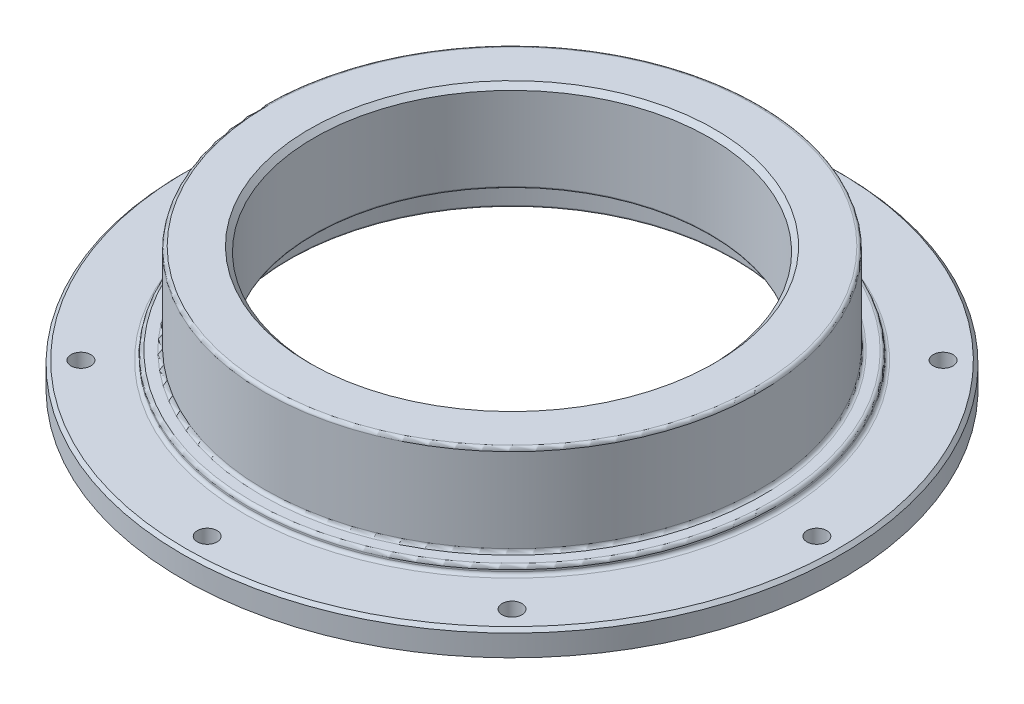
ISO-10303-21;
HEADER;
FILE_DESCRIPTION(('STEP AP214'),'2;1');
FILE_NAME('part.step','',(''),(''),'','','');
FILE_SCHEMA(('AUTOMOTIVE_DESIGN { 1 0 10303 214 1 1 1 1 }'));
ENDSEC;
DATA;
#1=APPLICATION_CONTEXT('core data for automotive mechanical design processes');
#2=APPLICATION_PROTOCOL_DEFINITION('international standard','automotive_design',2000,#1);
#3=PRODUCT_CONTEXT('',#1,'mechanical');
#4=PRODUCT('Part','Part','',(#3));
#5=PRODUCT_RELATED_PRODUCT_CATEGORY('part','',(#4));
#6=PRODUCT_DEFINITION_FORMATION('','',#4);
#7=PRODUCT_DEFINITION_CONTEXT('part definition',#1,'design');
#8=PRODUCT_DEFINITION('design','',#6,#7);
#9=PRODUCT_DEFINITION_SHAPE('','',#8);
#10=(LENGTH_UNIT() NAMED_UNIT(*) SI_UNIT(.MILLI.,.METRE.));
#11=(NAMED_UNIT(*) PLANE_ANGLE_UNIT() SI_UNIT($,.RADIAN.));
#12=(NAMED_UNIT(*) SI_UNIT($,.STERADIAN.) SOLID_ANGLE_UNIT());
#13=UNCERTAINTY_MEASURE_WITH_UNIT(LENGTH_MEASURE(1.E-05),#10,'distance_accuracy_value','');
#14=(GEOMETRIC_REPRESENTATION_CONTEXT(3) GLOBAL_UNCERTAINTY_ASSIGNED_CONTEXT((#13)) GLOBAL_UNIT_ASSIGNED_CONTEXT((#10,
#11,#12)) REPRESENTATION_CONTEXT('',''));
#15=CARTESIAN_POINT('',(0.,0.,0.));
#16=DIRECTION('',(0.,0.,1.));
#17=DIRECTION('',(1.,0.,0.));
#18=AXIS2_PLACEMENT_3D('',#15,#16,#17);
#19=CARTESIAN_POINT('',(0.,20.5,0.));
#20=DIRECTION('',(0.,-1.,0.));
#21=DIRECTION('',(0.,0.,-1.));
#22=AXIS2_PLACEMENT_3D('',#19,#20,#21);
#23=PLANE('',#22);
#24=CARTESIAN_POINT('',(0.,20.5,0.));
#25=DIRECTION('',(0.,-1.,0.));
#26=DIRECTION('',(0.,0.,-1.));
#27=AXIS2_PLACEMENT_3D('',#24,#25,#26);
#28=CIRCLE('',#27,121.);
#29=CARTESIAN_POINT('',(0.,20.5,-121.));
#30=VERTEX_POINT('',#29);
#31=EDGE_CURVE('E48',#30,#30,#28,.F.);
#32=ORIENTED_EDGE('',*,*,#31,.T.);
#33=EDGE_LOOP('',(#32));
#34=FACE_BOUND('',#33,.T.);
#35=CARTESIAN_POINT('',(0.,20.5,0.));
#36=DIRECTION('',(0.,-1.,0.));
#37=DIRECTION('',(0.,0.,-1.));
#38=AXIS2_PLACEMENT_3D('',#35,#36,#37);
#39=CIRCLE('',#38,134.);
#40=CARTESIAN_POINT('',(0.,20.5,-134.));
#41=VERTEX_POINT('',#40);
#42=EDGE_CURVE('E53',#41,#41,#39,.T.);
#43=ORIENTED_EDGE('',*,*,#42,.T.);
#44=EDGE_LOOP('',(#43));
#45=FACE_BOUND('',#44,.T.);
#46=ADVANCED_FACE('F33',(#34,#45),#23,.T.);
#47=CARTESIAN_POINT('',(0.,0.,0.));
#48=DIRECTION('',(0.,-1.,0.));
#49=DIRECTION('',(0.,0.,-1.));
#50=AXIS2_PLACEMENT_3D('',#47,#48,#49);
#51=CYLINDRICAL_SURFACE('',#50,135.);
#52=CARTESIAN_POINT('',(0.,1.,0.));
#53=DIRECTION('',(0.,-1.,0.));
#54=DIRECTION('',(0.,0.,-1.));
#55=AXIS2_PLACEMENT_3D('',#52,#53,#54);
#56=CIRCLE('',#55,135.);
#57=CARTESIAN_POINT('',(0.,1.,-135.));
#58=VERTEX_POINT('',#57);
#59=EDGE_CURVE('E40',#58,#58,#56,.T.);
#60=ORIENTED_EDGE('',*,*,#59,.T.);
#61=EDGE_LOOP('',(#60));
#62=FACE_BOUND('',#61,.T.);
#63=CARTESIAN_POINT('',(0.,19.5,0.));
#64=DIRECTION('',(0.,-1.,0.));
#65=DIRECTION('',(0.,0.,-1.));
#66=AXIS2_PLACEMENT_3D('',#63,#64,#65);
#67=CIRCLE('',#66,135.);
#68=CARTESIAN_POINT('',(0.,19.5,-135.));
#69=VERTEX_POINT('',#68);
#70=EDGE_CURVE('E44',#69,#69,#67,.F.);
#71=ORIENTED_EDGE('',*,*,#70,.T.);
#72=EDGE_LOOP('',(#71));
#73=FACE_BOUND('',#72,.T.);
#74=ADVANCED_FACE('F188',(#62,#73),#51,.F.);
#75=CARTESIAN_POINT('',(0.,0.,0.));
#76=DIRECTION('',(0.,-1.,0.));
#77=DIRECTION('',(0.,0.,-1.));
#78=AXIS2_PLACEMENT_3D('',#75,#76,#77);
#79=PLANE('',#78);
#80=CARTESIAN_POINT('',(0.,0.,0.));
#81=DIRECTION('',(0.,-1.,0.));
#82=DIRECTION('',(0.,0.,-1.));
#83=AXIS2_PLACEMENT_3D('',#80,#81,#82);
#84=CIRCLE('',#83,136.);
#85=CARTESIAN_POINT('',(0.,0.,-136.));
#86=VERTEX_POINT('',#85);
#87=EDGE_CURVE('E10',#86,#86,#84,.F.);
#88=ORIENTED_EDGE('',*,*,#87,.T.);
#89=EDGE_LOOP('',(#88));
#90=FACE_BOUND('',#89,.T.);
#91=CARTESIAN_POINT('',(185.,0.,6.4592404768598E-13));
#92=DIRECTION('',(0.,1.,0.));
#93=DIRECTION('',(-1.,0.,0.));
#94=AXIS2_PLACEMENT_3D('',#91,#92,#93);
#95=CIRCLE('',#94,6.);
#96=CARTESIAN_POINT('',(179.,0.,6.24975159652921E-13));
#97=VERTEX_POINT('',#96);
#98=EDGE_CURVE('E128',#97,#97,#95,.T.);
#99=ORIENTED_EDGE('',*,*,#98,.T.);
#100=EDGE_LOOP('',(#99));
#101=FACE_BOUND('',#100,.T.);
#102=CARTESIAN_POINT('',(130.814754519511,0.,130.814754519512));
#103=DIRECTION('',(0.,1.,0.));
#104=DIRECTION('',(-0.707106781186544,0.,-0.707106781186551));
#105=AXIS2_PLACEMENT_3D('',#102,#103,#104);
#106=CIRCLE('',#105,6.);
#107=CARTESIAN_POINT('',(126.572113832391,0.,126.572113832393));
#108=VERTEX_POINT('',#107);
#109=EDGE_CURVE('E122',#108,#108,#106,.T.);
#110=ORIENTED_EDGE('',*,*,#109,.T.);
#111=EDGE_LOOP('',(#110));
#112=FACE_BOUND('',#111,.T.);
#113=CARTESIAN_POINT('',(0.,0.,185.));
#114=DIRECTION('',(0.,1.,0.));
#115=DIRECTION('',(0.,0.,-1.));
#116=AXIS2_PLACEMENT_3D('',#113,#114,#115);
#117=CIRCLE('',#116,6.);
#118=CARTESIAN_POINT('',(0.,0.,179.));
#119=VERTEX_POINT('',#118);
#120=EDGE_CURVE('E114',#119,#119,#117,.T.);
#121=ORIENTED_EDGE('',*,*,#120,.T.);
#122=EDGE_LOOP('',(#121));
#123=FACE_BOUND('',#122,.T.);
#124=CARTESIAN_POINT('',(-130.814754519512,0.,130.81475451951));
#125=DIRECTION('',(0.,1.,0.));
#126=DIRECTION('',(0.707106781186554,0.,-0.707106781186541));
#127=AXIS2_PLACEMENT_3D('',#124,#125,#126);
#128=CIRCLE('',#127,6.);
#129=CARTESIAN_POINT('',(-126.572113832393,0.,126.572113832391));
#130=VERTEX_POINT('',#129);
#131=EDGE_CURVE('E115',#130,#130,#128,.T.);
#132=ORIENTED_EDGE('',*,*,#131,.T.);
#133=EDGE_LOOP('',(#132));
#134=FACE_BOUND('',#133,.T.);
#135=CARTESIAN_POINT('',(-185.,0.,-1.93777214305794E-12));
#136=DIRECTION('',(0.,1.,0.));
#137=DIRECTION('',(1.,0.,0.));
#138=AXIS2_PLACEMENT_3D('',#135,#136,#137);
#139=CIRCLE('',#138,6.);
#140=CARTESIAN_POINT('',(-179.,0.,-1.87492547895876E-12));
#141=VERTEX_POINT('',#140);
#142=EDGE_CURVE('E138',#141,#141,#139,.T.);
#143=ORIENTED_EDGE('',*,*,#142,.T.);
#144=EDGE_LOOP('',(#143));
#145=FACE_BOUND('',#144,.T.);
#146=CARTESIAN_POINT('',(-130.81475451951,0.,-130.814754519513));
#147=DIRECTION('',(0.,1.,0.));
#148=DIRECTION('',(0.707106781186539,0.,0.707106781186556));
#149=AXIS2_PLACEMENT_3D('',#146,#147,#148);
#150=CIRCLE('',#149,6.);
#151=CARTESIAN_POINT('',(-126.57211383239,0.,-126.572113832394));
#152=VERTEX_POINT('',#151);
#153=EDGE_CURVE('E139',#152,#152,#150,.T.);
#154=ORIENTED_EDGE('',*,*,#153,.T.);
#155=EDGE_LOOP('',(#154));
#156=FACE_BOUND('',#155,.T.);
#157=CARTESIAN_POINT('',(130.814754519512,0.,-130.814754519511));
#158=DIRECTION('',(0.,1.,0.));
#159=DIRECTION('',(-0.707106781186549,0.,0.707106781186546));
#160=AXIS2_PLACEMENT_3D('',#157,#158,#159);
#161=CIRCLE('',#160,6.);
#162=CARTESIAN_POINT('',(126.572113832392,0.,-126.572113832392));
#163=VERTEX_POINT('',#162);
#164=EDGE_CURVE('E107',#163,#163,#161,.T.);
#165=ORIENTED_EDGE('',*,*,#164,.T.);
#166=EDGE_LOOP('',(#165));
#167=FACE_BOUND('',#166,.T.);
#168=CARTESIAN_POINT('',(0.,0.,-185.));
#169=DIRECTION('',(0.,1.,0.));
#170=DIRECTION('',(0.,0.,1.));
#171=AXIS2_PLACEMENT_3D('',#168,#169,#170);
#172=CIRCLE('',#171,6.);
#173=CARTESIAN_POINT('',(0.,0.,-179.));
#174=VERTEX_POINT('',#173);
#175=EDGE_CURVE('E98',#174,#174,#172,.T.);
#176=ORIENTED_EDGE('',*,*,#175,.T.);
#177=EDGE_LOOP('',(#176));
#178=FACE_BOUND('',#177,.T.);
#179=CARTESIAN_POINT('',(0.,0.,0.));
#180=DIRECTION('',(0.,-1.,0.));
#181=DIRECTION('',(0.,0.,-1.));
#182=AXIS2_PLACEMENT_3D('',#179,#180,#181);
#183=CIRCLE('',#182,200.);
#184=CARTESIAN_POINT('',(0.,0.,-200.));
#185=VERTEX_POINT('',#184);
#186=EDGE_CURVE('E95',#185,#185,#183,.T.);
#187=ORIENTED_EDGE('',*,*,#186,.T.);
#188=EDGE_LOOP('',(#187));
#189=FACE_BOUND('',#188,.T.);
#190=ADVANCED_FACE('F147',(#90,#101,#112,#123,#134,#145,#156,#167,#178,#189),#79,.T.);
#191=CARTESIAN_POINT('',(0.,0.,0.));
#192=DIRECTION('',(0.,-1.,0.));
#193=DIRECTION('',(0.,0.,-1.));
#194=AXIS2_PLACEMENT_3D('',#191,#192,#193);
#195=CYLINDRICAL_SURFACE('',#194,200.);
#196=CARTESIAN_POINT('',(0.,13.,0.));
#197=DIRECTION('',(0.,1.,0.));
#198=DIRECTION('',(0.,0.,1.));
#199=AXIS2_PLACEMENT_3D('',#196,#197,#198);
#200=CIRCLE('',#199,200.);
#201=CARTESIAN_POINT('',(0.,13.,200.));
#202=VERTEX_POINT('',#201);
#203=EDGE_CURVE('E62',#202,#202,#200,.F.);
#204=ORIENTED_EDGE('',*,*,#203,.T.);
#205=EDGE_LOOP('',(#204));
#206=FACE_BOUND('',#205,.T.);
#207=ORIENTED_EDGE('',*,*,#186,.F.);
#208=EDGE_LOOP('',(#207));
#209=FACE_BOUND('',#208,.T.);
#210=ADVANCED_FACE('F162',(#206,#209),#195,.T.);
#211=CARTESIAN_POINT('',(0.,15.,0.));
#212=DIRECTION('',(0.,1.,0.));
#213=DIRECTION('',(0.,0.,1.));
#214=AXIS2_PLACEMENT_3D('',#211,#212,#213);
#215=PLANE('',#214);
#216=CARTESIAN_POINT('',(0.,15.,0.));
#217=DIRECTION('',(0.,1.,0.));
#218=DIRECTION('',(0.,0.,1.));
#219=AXIS2_PLACEMENT_3D('',#216,#217,#218);
#220=CIRCLE('',#219,198.);
#221=CARTESIAN_POINT('',(0.,15.,198.));
#222=VERTEX_POINT('',#221);
#223=EDGE_CURVE('E59',#222,#222,#220,.T.);
#224=ORIENTED_EDGE('',*,*,#223,.T.);
#225=EDGE_LOOP('',(#224));
#226=FACE_BOUND('',#225,.T.);
#227=CARTESIAN_POINT('',(0.,15.,0.));
#228=DIRECTION('',(0.,1.,0.));
#229=DIRECTION('',(0.,0.,1.));
#230=AXIS2_PLACEMENT_3D('',#227,#228,#229);
#231=CIRCLE('',#230,162.);
#232=CARTESIAN_POINT('',(0.,15.,162.));
#233=VERTEX_POINT('',#232);
#234=EDGE_CURVE('E65',#233,#233,#231,.F.);
#235=ORIENTED_EDGE('',*,*,#234,.T.);
#236=EDGE_LOOP('',(#235));
#237=FACE_BOUND('',#236,.T.);
#238=CARTESIAN_POINT('',(185.,15.,6.4592404768598E-13));
#239=DIRECTION('',(0.,1.,0.));
#240=DIRECTION('',(-1.,0.,0.));
#241=AXIS2_PLACEMENT_3D('',#238,#239,#240);
#242=CIRCLE('',#241,6.);
#243=CARTESIAN_POINT('',(179.,15.,6.24975159652921E-13));
#244=VERTEX_POINT('',#243);
#245=EDGE_CURVE('E110',#244,#244,#242,.T.);
#246=ORIENTED_EDGE('',*,*,#245,.F.);
#247=EDGE_LOOP('',(#246));
#248=FACE_BOUND('',#247,.T.);
#249=CARTESIAN_POINT('',(130.814754519511,15.,130.814754519512));
#250=DIRECTION('',(0.,1.,0.));
#251=DIRECTION('',(-0.707106781186544,0.,-0.707106781186551));
#252=AXIS2_PLACEMENT_3D('',#249,#250,#251);
#253=CIRCLE('',#252,6.);
#254=CARTESIAN_POINT('',(126.572113832391,15.,126.572113832393));
#255=VERTEX_POINT('',#254);
#256=EDGE_CURVE('E125',#255,#255,#253,.T.);
#257=ORIENTED_EDGE('',*,*,#256,.F.);
#258=EDGE_LOOP('',(#257));
#259=FACE_BOUND('',#258,.T.);
#260=CARTESIAN_POINT('',(0.,15.,185.));
#261=DIRECTION('',(0.,1.,0.));
#262=DIRECTION('',(0.,0.,-1.));
#263=AXIS2_PLACEMENT_3D('',#260,#261,#262);
#264=CIRCLE('',#263,6.);
#265=CARTESIAN_POINT('',(0.,15.,179.));
#266=VERTEX_POINT('',#265);
#267=EDGE_CURVE('E119',#266,#266,#264,.T.);
#268=ORIENTED_EDGE('',*,*,#267,.F.);
#269=EDGE_LOOP('',(#268));
#270=FACE_BOUND('',#269,.T.);
#271=CARTESIAN_POINT('',(-130.814754519512,15.,130.81475451951));
#272=DIRECTION('',(0.,1.,0.));
#273=DIRECTION('',(0.707106781186554,0.,-0.707106781186541));
#274=AXIS2_PLACEMENT_3D('',#271,#272,#273);
#275=CIRCLE('',#274,6.);
#276=CARTESIAN_POINT('',(-126.572113832393,15.,126.572113832391));
#277=VERTEX_POINT('',#276);
#278=EDGE_CURVE('E111',#277,#277,#275,.T.);
#279=ORIENTED_EDGE('',*,*,#278,.F.);
#280=EDGE_LOOP('',(#279));
#281=FACE_BOUND('',#280,.T.);
#282=CARTESIAN_POINT('',(-185.,15.,-1.93777214305794E-12));
#283=DIRECTION('',(0.,1.,0.));
#284=DIRECTION('',(1.,0.,0.));
#285=AXIS2_PLACEMENT_3D('',#282,#283,#284);
#286=CIRCLE('',#285,6.);
#287=CARTESIAN_POINT('',(-179.,15.,-1.87492547895876E-12));
#288=VERTEX_POINT('',#287);
#289=EDGE_CURVE('E118',#288,#288,#286,.T.);
#290=ORIENTED_EDGE('',*,*,#289,.F.);
#291=EDGE_LOOP('',(#290));
#292=FACE_BOUND('',#291,.T.);
#293=CARTESIAN_POINT('',(-130.81475451951,15.,-130.814754519513));
#294=DIRECTION('',(0.,1.,0.));
#295=DIRECTION('',(0.707106781186539,0.,0.707106781186556));
#296=AXIS2_PLACEMENT_3D('',#293,#294,#295);
#297=CIRCLE('',#296,6.);
#298=CARTESIAN_POINT('',(-126.57211383239,15.,-126.572113832394));
#299=VERTEX_POINT('',#298);
#300=EDGE_CURVE('E135',#299,#299,#297,.T.);
#301=ORIENTED_EDGE('',*,*,#300,.F.);
#302=EDGE_LOOP('',(#301));
#303=FACE_BOUND('',#302,.T.);
#304=CARTESIAN_POINT('',(130.814754519512,15.,-130.814754519511));
#305=DIRECTION('',(0.,1.,0.));
#306=DIRECTION('',(-0.707106781186549,0.,0.707106781186546));
#307=AXIS2_PLACEMENT_3D('',#304,#305,#306);
#308=CIRCLE('',#307,6.);
#309=CARTESIAN_POINT('',(126.572113832392,15.,-126.572113832392));
#310=VERTEX_POINT('',#309);
#311=EDGE_CURVE('E102',#310,#310,#308,.T.);
#312=ORIENTED_EDGE('',*,*,#311,.F.);
#313=EDGE_LOOP('',(#312));
#314=FACE_BOUND('',#313,.T.);
#315=CARTESIAN_POINT('',(0.,15.,-185.));
#316=DIRECTION('',(0.,1.,0.));
#317=DIRECTION('',(0.,0.,1.));
#318=AXIS2_PLACEMENT_3D('',#315,#316,#317);
#319=CIRCLE('',#318,6.);
#320=CARTESIAN_POINT('',(0.,15.,-179.));
#321=VERTEX_POINT('',#320);
#322=EDGE_CURVE('E99',#321,#321,#319,.T.);
#323=ORIENTED_EDGE('',*,*,#322,.F.);
#324=EDGE_LOOP('',(#323));
#325=FACE_BOUND('',#324,.T.);
#326=ADVANCED_FACE('F158',(#226,#237,#248,#259,#270,#281,#292,#303,#314,#325),#215,.T.);
#327=CARTESIAN_POINT('',(0.,0.,0.));
#328=DIRECTION('',(0.,-1.,0.));
#329=DIRECTION('',(0.,0.,-1.));
#330=AXIS2_PLACEMENT_3D('',#327,#328,#329);
#331=CYLINDRICAL_SURFACE('',#330,160.);
#332=CARTESIAN_POINT('',(0.,18.,0.));
#333=DIRECTION('',(0.,1.,0.));
#334=DIRECTION('',(0.,0.,1.));
#335=AXIS2_PLACEMENT_3D('',#332,#333,#334);
#336=CIRCLE('',#335,160.);
#337=CARTESIAN_POINT('',(0.,18.,160.));
#338=VERTEX_POINT('',#337);
#339=EDGE_CURVE('E74',#338,#338,#336,.F.);
#340=ORIENTED_EDGE('',*,*,#339,.T.);
#341=EDGE_LOOP('',(#340));
#342=FACE_BOUND('',#341,.T.);
#343=CARTESIAN_POINT('',(0.,17.,0.));
#344=DIRECTION('',(0.,1.,0.));
#345=DIRECTION('',(0.,0.,1.));
#346=AXIS2_PLACEMENT_3D('',#343,#344,#345);
#347=CIRCLE('',#346,160.);
#348=CARTESIAN_POINT('',(0.,17.,160.));
#349=VERTEX_POINT('',#348);
#350=EDGE_CURVE('E77',#349,#349,#347,.T.);
#351=ORIENTED_EDGE('',*,*,#350,.T.);
#352=EDGE_LOOP('',(#351));
#353=FACE_BOUND('',#352,.T.);
#354=ADVANCED_FACE('F161',(#342,#353),#331,.T.);
#355=CARTESIAN_POINT('',(0.,20.,0.));
#356=DIRECTION('',(0.,1.,0.));
#357=DIRECTION('',(0.,0.,1.));
#358=AXIS2_PLACEMENT_3D('',#355,#356,#357);
#359=PLANE('',#358);
#360=CARTESIAN_POINT('',(0.,20.,0.));
#361=DIRECTION('',(0.,1.,0.));
#362=DIRECTION('',(0.,0.,1.));
#363=AXIS2_PLACEMENT_3D('',#360,#361,#362);
#364=CIRCLE('',#363,158.);
#365=CARTESIAN_POINT('',(0.,20.,158.));
#366=VERTEX_POINT('',#365);
#367=EDGE_CURVE('E68',#366,#366,#364,.T.);
#368=ORIENTED_EDGE('',*,*,#367,.T.);
#369=EDGE_LOOP('',(#368));
#370=FACE_BOUND('',#369,.T.);
#371=CARTESIAN_POINT('',(0.,20.,0.));
#372=DIRECTION('',(0.,1.,0.));
#373=DIRECTION('',(0.,0.,1.));
#374=AXIS2_PLACEMENT_3D('',#371,#372,#373);
#375=CIRCLE('',#374,152.);
#376=CARTESIAN_POINT('',(0.,20.,152.));
#377=VERTEX_POINT('',#376);
#378=EDGE_CURVE('E71',#377,#377,#375,.F.);
#379=ORIENTED_EDGE('',*,*,#378,.T.);
#380=EDGE_LOOP('',(#379));
#381=FACE_BOUND('',#380,.T.);
#382=ADVANCED_FACE('F341',(#370,#381),#359,.T.);
#383=CARTESIAN_POINT('',(0.,0.,0.));
#384=DIRECTION('',(0.,-1.,0.));
#385=DIRECTION('',(0.,0.,-1.));
#386=AXIS2_PLACEMENT_3D('',#383,#384,#385);
#387=CYLINDRICAL_SURFACE('',#386,150.);
#388=CARTESIAN_POINT('',(0.,73.,0.));
#389=DIRECTION('',(0.,1.,0.));
#390=DIRECTION('',(0.,0.,1.));
#391=AXIS2_PLACEMENT_3D('',#388,#389,#390);
#392=CIRCLE('',#391,150.);
#393=CARTESIAN_POINT('',(0.,73.,150.));
#394=VERTEX_POINT('',#393);
#395=EDGE_CURVE('E83',#394,#394,#392,.F.);
#396=ORIENTED_EDGE('',*,*,#395,.T.);
#397=EDGE_LOOP('',(#396));
#398=FACE_BOUND('',#397,.T.);
#399=CARTESIAN_POINT('',(0.,22.,0.));
#400=DIRECTION('',(0.,1.,0.));
#401=DIRECTION('',(0.,0.,1.));
#402=AXIS2_PLACEMENT_3D('',#399,#400,#401);
#403=CIRCLE('',#402,150.);
#404=CARTESIAN_POINT('',(0.,22.,150.));
#405=VERTEX_POINT('',#404);
#406=EDGE_CURVE('E86',#405,#405,#403,.T.);
#407=ORIENTED_EDGE('',*,*,#406,.T.);
#408=EDGE_LOOP('',(#407));
#409=FACE_BOUND('',#408,.T.);
#410=ADVANCED_FACE('F331',(#398,#409),#387,.T.);
#411=CARTESIAN_POINT('',(0.,75.,0.));
#412=DIRECTION('',(0.,1.,0.));
#413=DIRECTION('',(0.,0.,1.));
#414=AXIS2_PLACEMENT_3D('',#411,#412,#413);
#415=PLANE('',#414);
#416=CARTESIAN_POINT('',(0.,75.,0.));
#417=DIRECTION('',(0.,1.,0.));
#418=DIRECTION('',(0.,0.,1.));
#419=AXIS2_PLACEMENT_3D('',#416,#417,#418);
#420=CIRCLE('',#419,148.);
#421=CARTESIAN_POINT('',(0.,75.,148.));
#422=VERTEX_POINT('',#421);
#423=EDGE_CURVE('E80',#422,#422,#420,.T.);
#424=ORIENTED_EDGE('',*,*,#423,.T.);
#425=EDGE_LOOP('',(#424));
#426=FACE_BOUND('',#425,.T.);
#427=CARTESIAN_POINT('',(0.,75.,0.));
#428=DIRECTION('',(0.,1.,0.));
#429=DIRECTION('',(0.,0.,1.));
#430=AXIS2_PLACEMENT_3D('',#427,#428,#429);
#431=CIRCLE('',#430,123.);
#432=CARTESIAN_POINT('',(0.,75.,123.));
#433=VERTEX_POINT('',#432);
#434=EDGE_CURVE('E92',#433,#433,#431,.F.);
#435=ORIENTED_EDGE('',*,*,#434,.T.);
#436=EDGE_LOOP('',(#435));
#437=FACE_BOUND('',#436,.T.);
#438=ADVANCED_FACE('F183',(#426,#437),#415,.T.);
#439=CARTESIAN_POINT('',(0.,0.,0.));
#440=DIRECTION('',(0.,-1.,0.));
#441=DIRECTION('',(0.,0.,-1.));
#442=AXIS2_PLACEMENT_3D('',#439,#440,#441);
#443=CYLINDRICAL_SURFACE('',#442,120.);
#444=CARTESIAN_POINT('',(0.,21.5,0.));
#445=DIRECTION('',(0.,-1.,0.));
#446=DIRECTION('',(0.,0.,-1.));
#447=AXIS2_PLACEMENT_3D('',#444,#445,#446);
#448=CIRCLE('',#447,120.);
#449=CARTESIAN_POINT('',(0.,21.5,-120.));
#450=VERTEX_POINT('',#449);
#451=EDGE_CURVE('E56',#450,#450,#448,.T.);
#452=ORIENTED_EDGE('',*,*,#451,.T.);
#453=EDGE_LOOP('',(#452));
#454=FACE_BOUND('',#453,.T.);
#455=CARTESIAN_POINT('',(0.,72.,0.));
#456=DIRECTION('',(0.,1.,0.));
#457=DIRECTION('',(0.,0.,1.));
#458=AXIS2_PLACEMENT_3D('',#455,#456,#457);
#459=CIRCLE('',#458,120.);
#460=CARTESIAN_POINT('',(0.,72.,120.));
#461=VERTEX_POINT('',#460);
#462=EDGE_CURVE('E89',#461,#461,#459,.T.);
#463=ORIENTED_EDGE('',*,*,#462,.T.);
#464=EDGE_LOOP('',(#463));
#465=FACE_BOUND('',#464,.T.);
#466=ADVANCED_FACE('F174',(#454,#465),#443,.F.);
#467=CARTESIAN_POINT('',(0.,0.,-185.));
#468=DIRECTION('',(0.,1.,0.));
#469=DIRECTION('',(0.,0.,1.));
#470=AXIS2_PLACEMENT_3D('',#467,#468,#469);
#471=CYLINDRICAL_SURFACE('',#470,6.);
#472=ORIENTED_EDGE('',*,*,#175,.F.);
#473=EDGE_LOOP('',(#472));
#474=FACE_BOUND('',#473,.T.);
#475=ORIENTED_EDGE('',*,*,#322,.T.);
#476=EDGE_LOOP('',(#475));
#477=FACE_BOUND('',#476,.T.);
#478=ADVANCED_FACE('F171',(#474,#477),#471,.F.);
#479=CARTESIAN_POINT('',(130.814754519512,0.,-130.814754519511));
#480=DIRECTION('',(0.,1.,0.));
#481=DIRECTION('',(-0.707106781186549,0.,0.707106781186546));
#482=AXIS2_PLACEMENT_3D('',#479,#480,#481);
#483=CYLINDRICAL_SURFACE('',#482,6.);
#484=ORIENTED_EDGE('',*,*,#164,.F.);
#485=EDGE_LOOP('',(#484));
#486=FACE_BOUND('',#485,.T.);
#487=ORIENTED_EDGE('',*,*,#311,.T.);
#488=EDGE_LOOP('',(#487));
#489=FACE_BOUND('',#488,.T.);
#490=ADVANCED_FACE('F173',(#486,#489),#483,.F.);
#491=CARTESIAN_POINT('',(-130.81475451951,0.,-130.814754519513));
#492=DIRECTION('',(0.,1.,0.));
#493=DIRECTION('',(0.707106781186539,0.,0.707106781186556));
#494=AXIS2_PLACEMENT_3D('',#491,#492,#493);
#495=CYLINDRICAL_SURFACE('',#494,6.);
#496=ORIENTED_EDGE('',*,*,#153,.F.);
#497=EDGE_LOOP('',(#496));
#498=FACE_BOUND('',#497,.T.);
#499=ORIENTED_EDGE('',*,*,#300,.T.);
#500=EDGE_LOOP('',(#499));
#501=FACE_BOUND('',#500,.T.);
#502=ADVANCED_FACE('F154',(#498,#501),#495,.F.);
#503=CARTESIAN_POINT('',(-185.,0.,-1.93777214305794E-12));
#504=DIRECTION('',(0.,1.,0.));
#505=DIRECTION('',(1.,0.,0.));
#506=AXIS2_PLACEMENT_3D('',#503,#504,#505);
#507=CYLINDRICAL_SURFACE('',#506,6.);
#508=ORIENTED_EDGE('',*,*,#142,.F.);
#509=EDGE_LOOP('',(#508));
#510=FACE_BOUND('',#509,.T.);
#511=ORIENTED_EDGE('',*,*,#289,.T.);
#512=EDGE_LOOP('',(#511));
#513=FACE_BOUND('',#512,.T.);
#514=ADVANCED_FACE('F150',(#510,#513),#507,.F.);
#515=CARTESIAN_POINT('',(-130.814754519512,0.,130.81475451951));
#516=DIRECTION('',(0.,1.,0.));
#517=DIRECTION('',(0.707106781186554,0.,-0.707106781186541));
#518=AXIS2_PLACEMENT_3D('',#515,#516,#517);
#519=CYLINDRICAL_SURFACE('',#518,6.);
#520=ORIENTED_EDGE('',*,*,#131,.F.);
#521=EDGE_LOOP('',(#520));
#522=FACE_BOUND('',#521,.T.);
#523=ORIENTED_EDGE('',*,*,#278,.T.);
#524=EDGE_LOOP('',(#523));
#525=FACE_BOUND('',#524,.T.);
#526=ADVANCED_FACE('F153',(#522,#525),#519,.F.);
#527=CARTESIAN_POINT('',(0.,0.,185.));
#528=DIRECTION('',(0.,1.,0.));
#529=DIRECTION('',(0.,0.,-1.));
#530=AXIS2_PLACEMENT_3D('',#527,#528,#529);
#531=CYLINDRICAL_SURFACE('',#530,6.);
#532=ORIENTED_EDGE('',*,*,#120,.F.);
#533=EDGE_LOOP('',(#532));
#534=FACE_BOUND('',#533,.T.);
#535=ORIENTED_EDGE('',*,*,#267,.T.);
#536=EDGE_LOOP('',(#535));
#537=FACE_BOUND('',#536,.T.);
#538=ADVANCED_FACE('F382',(#534,#537),#531,.F.);
#539=CARTESIAN_POINT('',(130.814754519511,0.,130.814754519512));
#540=DIRECTION('',(0.,1.,0.));
#541=DIRECTION('',(-0.707106781186544,0.,-0.707106781186551));
#542=AXIS2_PLACEMENT_3D('',#539,#540,#541);
#543=CYLINDRICAL_SURFACE('',#542,6.);
#544=ORIENTED_EDGE('',*,*,#109,.F.);
#545=EDGE_LOOP('',(#544));
#546=FACE_BOUND('',#545,.T.);
#547=ORIENTED_EDGE('',*,*,#256,.T.);
#548=EDGE_LOOP('',(#547));
#549=FACE_BOUND('',#548,.T.);
#550=ADVANCED_FACE('F372',(#546,#549),#543,.F.);
#551=CARTESIAN_POINT('',(185.,0.,6.4592404768598E-13));
#552=DIRECTION('',(0.,1.,0.));
#553=DIRECTION('',(-1.,0.,0.));
#554=AXIS2_PLACEMENT_3D('',#551,#552,#553);
#555=CYLINDRICAL_SURFACE('',#554,6.);
#556=ORIENTED_EDGE('',*,*,#98,.F.);
#557=EDGE_LOOP('',(#556));
#558=FACE_BOUND('',#557,.T.);
#559=ORIENTED_EDGE('',*,*,#245,.T.);
#560=EDGE_LOOP('',(#559));
#561=FACE_BOUND('',#560,.T.);
#562=ADVANCED_FACE('F202',(#558,#561),#555,.F.);
#563=CARTESIAN_POINT('',(0.,75.,0.));
#564=DIRECTION('',(0.,1.,0.));
#565=DIRECTION('',(0.,0.,1.));
#566=AXIS2_PLACEMENT_3D('',#563,#564,#565);
#567=CONICAL_SURFACE('',#566,123.,0.785398163397453);
#568=CARTESIAN_POINT('',(0.,72.,120.));
#569=CARTESIAN_POINT('',(0.,72.03125,120.03125));
#570=CARTESIAN_POINT('',(0.,72.0625,120.0625));
#571=CARTESIAN_POINT('',(0.,72.125,120.125));
#572=CARTESIAN_POINT('',(0.,72.15625,120.15625));
#573=CARTESIAN_POINT('',(0.,72.21875,120.21875));
#574=CARTESIAN_POINT('',(0.,72.25,120.25));
#575=CARTESIAN_POINT('',(0.,72.3125,120.3125));
#576=CARTESIAN_POINT('',(0.,72.34375,120.34375));
#577=CARTESIAN_POINT('',(0.,72.40625,120.40625));
#578=CARTESIAN_POINT('',(0.,72.4375,120.4375));
#579=CARTESIAN_POINT('',(0.,72.5,120.5));
#580=CARTESIAN_POINT('',(0.,72.53125,120.53125));
#581=CARTESIAN_POINT('',(0.,72.59375,120.59375));
#582=CARTESIAN_POINT('',(0.,72.625,120.625));
#583=CARTESIAN_POINT('',(0.,72.6875,120.6875));
#584=CARTESIAN_POINT('',(0.,72.71875,120.71875));
#585=CARTESIAN_POINT('',(0.,72.78125,120.78125));
#586=CARTESIAN_POINT('',(0.,72.8125,120.8125));
#587=CARTESIAN_POINT('',(0.,72.875,120.875));
#588=CARTESIAN_POINT('',(0.,72.90625,120.90625));
#589=CARTESIAN_POINT('',(0.,72.96875,120.96875));
#590=CARTESIAN_POINT('',(0.,73.,121.));
#591=CARTESIAN_POINT('',(0.,73.0625,121.0625));
#592=CARTESIAN_POINT('',(0.,73.09375,121.09375));
#593=CARTESIAN_POINT('',(0.,73.15625,121.15625));
#594=CARTESIAN_POINT('',(0.,73.1875,121.1875));
#595=CARTESIAN_POINT('',(0.,73.25,121.25));
#596=CARTESIAN_POINT('',(0.,73.28125,121.28125));
#597=CARTESIAN_POINT('',(0.,73.34375,121.34375));
#598=CARTESIAN_POINT('',(0.,73.375,121.375));
#599=CARTESIAN_POINT('',(0.,73.4375,121.4375));
#600=CARTESIAN_POINT('',(0.,73.46875,121.46875));
#601=CARTESIAN_POINT('',(0.,73.53125,121.53125));
#602=CARTESIAN_POINT('',(0.,73.5625,121.5625));
#603=CARTESIAN_POINT('',(0.,73.625,121.625));
#604=CARTESIAN_POINT('',(0.,73.65625,121.65625));
#605=CARTESIAN_POINT('',(0.,73.71875,121.71875));
#606=CARTESIAN_POINT('',(0.,73.75,121.75));
#607=CARTESIAN_POINT('',(0.,73.8125,121.8125));
#608=CARTESIAN_POINT('',(0.,73.84375,121.84375));
#609=CARTESIAN_POINT('',(0.,73.90625,121.90625));
#610=CARTESIAN_POINT('',(0.,73.9375,121.9375));
#611=CARTESIAN_POINT('',(0.,74.,122.));
#612=CARTESIAN_POINT('',(0.,74.03125,122.03125));
#613=CARTESIAN_POINT('',(0.,74.09375,122.09375));
#614=CARTESIAN_POINT('',(0.,74.125,122.125));
#615=CARTESIAN_POINT('',(0.,74.1875,122.1875));
#616=CARTESIAN_POINT('',(0.,74.21875,122.21875));
#617=CARTESIAN_POINT('',(0.,74.28125,122.28125));
#618=CARTESIAN_POINT('',(0.,74.3125,122.3125));
#619=CARTESIAN_POINT('',(0.,74.375,122.375));
#620=CARTESIAN_POINT('',(0.,74.40625,122.40625));
#621=CARTESIAN_POINT('',(0.,74.46875,122.46875));
#622=CARTESIAN_POINT('',(0.,74.5,122.5));
#623=CARTESIAN_POINT('',(0.,74.5625,122.5625));
#624=CARTESIAN_POINT('',(0.,74.59375,122.59375));
#625=CARTESIAN_POINT('',(0.,74.65625,122.65625));
#626=CARTESIAN_POINT('',(0.,74.6875,122.6875));
#627=CARTESIAN_POINT('',(0.,74.75,122.75));
#628=CARTESIAN_POINT('',(0.,74.78125,122.78125));
#629=CARTESIAN_POINT('',(0.,74.84375,122.84375));
#630=CARTESIAN_POINT('',(0.,74.875,122.875));
#631=CARTESIAN_POINT('',(0.,74.9375,122.9375));
#632=CARTESIAN_POINT('',(0.,74.96875,122.96875));
#633=CARTESIAN_POINT('',(0.,75.,123.));
#634=B_SPLINE_CURVE_WITH_KNOTS('',3,(#568,#569,#570,#571,#572,#573,#574,#575,#576,#577,#578,
#579,#580,#581,#582,#583,#584,#585,#586,#587,#588,#589,#590,#591,#592,#593,#594,#595,#596,#597,
#598,#599,#600,#601,#602,#603,#604,#605,#606,#607,#608,#609,#610,#611,#612,#613,#614,#615,#616,
#617,#618,#619,#620,#621,#622,#623,#624,#625,#626,#627,#628,#629,#630,#631,#632,#633),
.UNSPECIFIED.,.F.,.F.,(4,2,2,2,2,2,2,2,2,2,2,2,2,2,2,2,2,2,2,2,2,2,2,2,2,2,2,2,2,2,2,2,4),(0.,
0.132582521472483,0.265165042944965,0.397747564417448,0.530330085889911,0.662912607362394,
0.795495128834877,0.928077650307349,1.06066017177982,1.1932426932523,1.32582521472478,
1.45840773619726,1.59099025766973,1.72357277914221,1.85615530061469,1.98873782208717,
2.12132034355963,2.25390286503212,2.3864853865046,2.51906790797708,2.65165042944955,
2.78423295092203,2.91681547239451,3.04939799386698,3.18198051533946,3.31456303681194,
3.44714555828441,3.5797280797569,3.71231060122937,3.84489312270184,3.97747564417432,
4.11005816564681,4.24264068711928),.UNSPECIFIED.);
#635=EDGE_CURVE('BSEAM198',#461,#433,#634,.T.);
#636=ORIENTED_EDGE('',*,*,#462,.F.);
#637=ORIENTED_EDGE('',*,*,#434,.F.);
#638=ORIENTED_EDGE('',*,*,#635,.T.);
#639=ORIENTED_EDGE('',*,*,#635,.F.);
#640=EDGE_LOOP('',(#636,#638,#637,#639));
#641=FACE_BOUND('',#640,.T.);
#642=ADVANCED_FACE('F198',(#641),#567,.F.);
#643=CARTESIAN_POINT('',(0.,73.,0.));
#644=DIRECTION('',(0.,1.,0.));
#645=DIRECTION('',(0.,0.,1.));
#646=AXIS2_PLACEMENT_3D('',#643,#644,#645);
#647=TOROIDAL_SURFACE('',#646,148.,2.);
#648=ORIENTED_EDGE('',*,*,#423,.F.);
#649=EDGE_LOOP('',(#648));
#650=FACE_BOUND('',#649,.T.);
#651=ORIENTED_EDGE('',*,*,#395,.F.);
#652=EDGE_LOOP('',(#651));
#653=FACE_BOUND('',#652,.T.);
#654=ADVANCED_FACE('F201',(#650,#653),#647,.T.);
#655=CARTESIAN_POINT('',(0.,18.,0.));
#656=DIRECTION('',(0.,1.,0.));
#657=DIRECTION('',(0.,0.,1.));
#658=AXIS2_PLACEMENT_3D('',#655,#656,#657);
#659=TOROIDAL_SURFACE('',#658,158.,2.);
#660=ORIENTED_EDGE('',*,*,#367,.F.);
#661=EDGE_LOOP('',(#660));
#662=FACE_BOUND('',#661,.T.);
#663=ORIENTED_EDGE('',*,*,#339,.F.);
#664=EDGE_LOOP('',(#663));
#665=FACE_BOUND('',#664,.T.);
#666=ADVANCED_FACE('F206',(#662,#665),#659,.T.);
#667=CARTESIAN_POINT('',(0.,17.,0.));
#668=DIRECTION('',(0.,1.,0.));
#669=DIRECTION('',(0.,0.,1.));
#670=AXIS2_PLACEMENT_3D('',#667,#668,#669);
#671=TOROIDAL_SURFACE('',#670,162.,2.);
#672=ORIENTED_EDGE('',*,*,#350,.F.);
#673=EDGE_LOOP('',(#672));
#674=FACE_BOUND('',#673,.T.);
#675=ORIENTED_EDGE('',*,*,#234,.F.);
#676=EDGE_LOOP('',(#675));
#677=FACE_BOUND('',#676,.T.);
#678=ADVANCED_FACE('F210',(#674,#677),#671,.F.);
#679=CARTESIAN_POINT('',(0.,22.,0.));
#680=DIRECTION('',(0.,1.,0.));
#681=DIRECTION('',(0.,0.,1.));
#682=AXIS2_PLACEMENT_3D('',#679,#680,#681);
#683=TOROIDAL_SURFACE('',#682,152.,2.);
#684=ORIENTED_EDGE('',*,*,#406,.F.);
#685=EDGE_LOOP('',(#684));
#686=FACE_BOUND('',#685,.T.);
#687=ORIENTED_EDGE('',*,*,#378,.F.);
#688=EDGE_LOOP('',(#687));
#689=FACE_BOUND('',#688,.T.);
#690=ADVANCED_FACE('F214',(#686,#689),#683,.F.);
#691=CARTESIAN_POINT('',(0.,13.,0.));
#692=DIRECTION('',(0.,-1.,0.));
#693=DIRECTION('',(0.,0.,-1.));
#694=AXIS2_PLACEMENT_3D('',#691,#692,#693);
#695=CONICAL_SURFACE('',#694,200.,0.785398163397455);
#696=ORIENTED_EDGE('',*,*,#223,.F.);
#697=EDGE_LOOP('',(#696));
#698=FACE_BOUND('',#697,.T.);
#699=ORIENTED_EDGE('',*,*,#203,.F.);
#700=EDGE_LOOP('',(#699));
#701=FACE_BOUND('',#700,.T.);
#702=ADVANCED_FACE('F218',(#698,#701),#695,.T.);
#703=CARTESIAN_POINT('',(0.,21.5,0.));
#704=DIRECTION('',(0.,-1.,0.));
#705=DIRECTION('',(0.,0.,-1.));
#706=AXIS2_PLACEMENT_3D('',#703,#704,#705);
#707=TOROIDAL_SURFACE('',#706,121.,1.);
#708=ORIENTED_EDGE('',*,*,#31,.F.);
#709=EDGE_LOOP('',(#708));
#710=FACE_BOUND('',#709,.T.);
#711=ORIENTED_EDGE('',*,*,#451,.F.);
#712=EDGE_LOOP('',(#711));
#713=FACE_BOUND('',#712,.T.);
#714=ADVANCED_FACE('F222',(#710,#713),#707,.T.);
#715=CARTESIAN_POINT('',(0.,1.,0.));
#716=DIRECTION('',(0.,-1.,0.));
#717=DIRECTION('',(0.,0.,-1.));
#718=AXIS2_PLACEMENT_3D('',#715,#716,#717);
#719=TOROIDAL_SURFACE('',#718,136.,1.);
#720=ORIENTED_EDGE('',*,*,#87,.F.);
#721=EDGE_LOOP('',(#720));
#722=FACE_BOUND('',#721,.T.);
#723=ORIENTED_EDGE('',*,*,#59,.F.);
#724=EDGE_LOOP('',(#723));
#725=FACE_BOUND('',#724,.T.);
#726=ADVANCED_FACE('F225',(#722,#725),#719,.T.);
#727=CARTESIAN_POINT('',(0.,19.5,0.));
#728=DIRECTION('',(0.,-1.,0.));
#729=DIRECTION('',(0.,0.,-1.));
#730=AXIS2_PLACEMENT_3D('',#727,#728,#729);
#731=TOROIDAL_SURFACE('',#730,134.,1.);
#732=ORIENTED_EDGE('',*,*,#70,.F.);
#733=EDGE_LOOP('',(#732));
#734=FACE_BOUND('',#733,.T.);
#735=ORIENTED_EDGE('',*,*,#42,.F.);
#736=EDGE_LOOP('',(#735));
#737=FACE_BOUND('',#736,.T.);
#738=ADVANCED_FACE('F35',(#734,#737),#731,.F.);
#739=CLOSED_SHELL('',(#46,#74,#190,#210,#326,#354,#382,#410,#438,#466,#478,#490,#502,#514,#526,
#538,#550,#562,#642,#654,#666,#678,#690,#702,#714,#726,#738));
#740=MANIFOLD_SOLID_BREP('B2',#739);
#741=ADVANCED_BREP_SHAPE_REPRESENTATION('',(#18,#740),#14);
#742=SHAPE_DEFINITION_REPRESENTATION(#9,#741);
ENDSEC;
END-ISO-10303-21;
